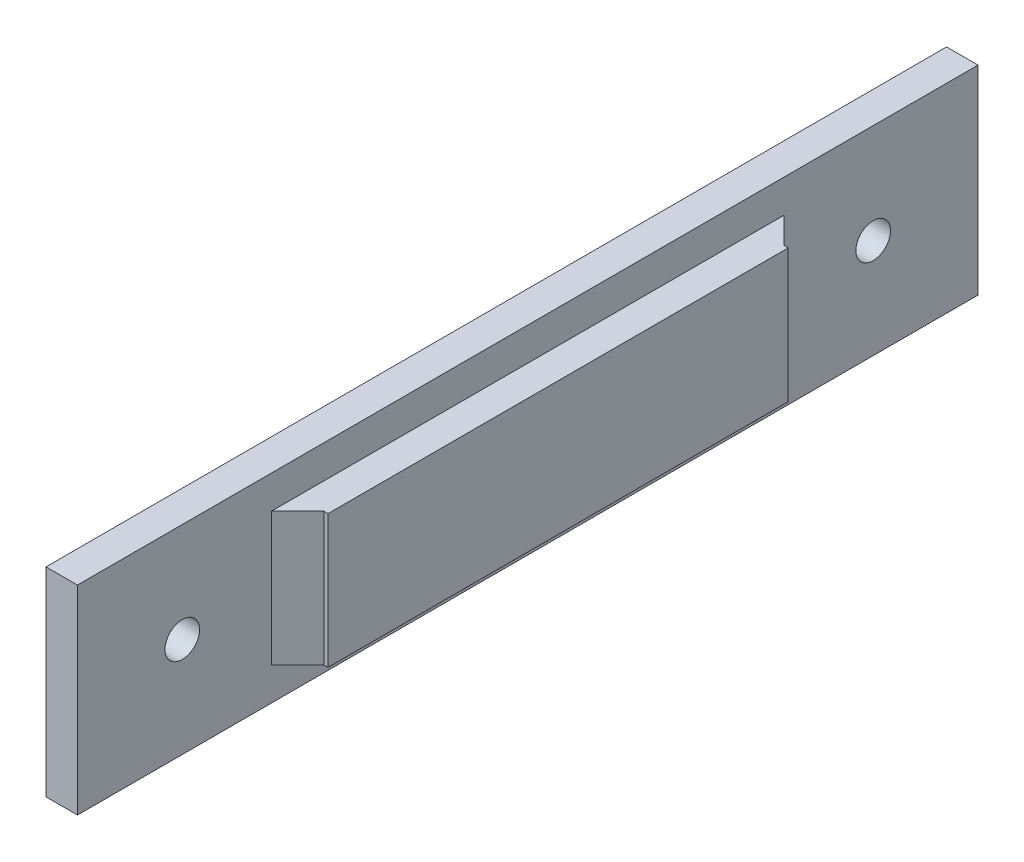
ISO-10303-21;
HEADER;
FILE_DESCRIPTION(('STEP AP214'),'2;1');
FILE_NAME('part.step','',(''),(''),'','','');
FILE_SCHEMA(('AUTOMOTIVE_DESIGN { 1 0 10303 214 1 1 1 1 }'));
ENDSEC;
DATA;
#1=APPLICATION_CONTEXT('core data for automotive mechanical design processes');
#2=APPLICATION_PROTOCOL_DEFINITION('international standard','automotive_design',2000,#1);
#3=PRODUCT_CONTEXT('',#1,'mechanical');
#4=PRODUCT('Part','Part','',(#3));
#5=PRODUCT_RELATED_PRODUCT_CATEGORY('part','',(#4));
#6=PRODUCT_DEFINITION_FORMATION('','',#4);
#7=PRODUCT_DEFINITION_CONTEXT('part definition',#1,'design');
#8=PRODUCT_DEFINITION('design','',#6,#7);
#9=PRODUCT_DEFINITION_SHAPE('','',#8);
#10=(LENGTH_UNIT() NAMED_UNIT(*) SI_UNIT(.MILLI.,.METRE.));
#11=(NAMED_UNIT(*) PLANE_ANGLE_UNIT() SI_UNIT($,.RADIAN.));
#12=(NAMED_UNIT(*) SI_UNIT($,.STERADIAN.) SOLID_ANGLE_UNIT());
#13=UNCERTAINTY_MEASURE_WITH_UNIT(LENGTH_MEASURE(1.E-05),#10,'distance_accuracy_value','');
#14=(GEOMETRIC_REPRESENTATION_CONTEXT(3) GLOBAL_UNCERTAINTY_ASSIGNED_CONTEXT((#13)) GLOBAL_UNIT_ASSIGNED_CONTEXT((#10,
#11,#12)) REPRESENTATION_CONTEXT('',''));
#15=CARTESIAN_POINT('',(0.,0.,0.));
#16=DIRECTION('',(0.,0.,1.));
#17=DIRECTION('',(1.,0.,0.));
#18=AXIS2_PLACEMENT_3D('',#15,#16,#17);
#19=CARTESIAN_POINT('',(0.,0.,85.9));
#20=DIRECTION('',(0.,0.,1.));
#21=DIRECTION('',(1.,0.,0.));
#22=AXIS2_PLACEMENT_3D('',#19,#20,#21);
#23=PLANE('',#22);
#24=DIRECTION('',(1.,0.,0.));
#25=VECTOR('',#24,1.);
#26=CARTESIAN_POINT('',(0.,-3.,85.9));
#27=LINE('',#26,#25);
#28=CARTESIAN_POINT('',(-3.,-3.,85.9));
#29=VERTEX_POINT('',#28);
#30=CARTESIAN_POINT('',(0.,-3.,85.9));
#31=VERTEX_POINT('',#30);
#32=EDGE_CURVE('E192',#29,#31,#27,.T.);
#33=ORIENTED_EDGE('',*,*,#32,.T.);
#34=DIRECTION('',(0.,-1.,0.));
#35=VECTOR('',#34,1.);
#36=CARTESIAN_POINT('',(0.,0.,85.9));
#37=LINE('',#36,#35);
#38=CARTESIAN_POINT('',(0.,16.,85.9));
#39=VERTEX_POINT('',#38);
#40=EDGE_CURVE('E185',#39,#31,#37,.T.);
#41=ORIENTED_EDGE('',*,*,#40,.F.);
#42=DIRECTION('',(-1.,0.,0.));
#43=VECTOR('',#42,1.);
#44=CARTESIAN_POINT('',(0.,16.,85.9));
#45=LINE('',#44,#43);
#46=CARTESIAN_POINT('',(-3.,16.,85.9));
#47=VERTEX_POINT('',#46);
#48=EDGE_CURVE('E196',#39,#47,#45,.T.);
#49=ORIENTED_EDGE('',*,*,#48,.T.);
#50=DIRECTION('',(0.,-1.,0.));
#51=VECTOR('',#50,1.);
#52=CARTESIAN_POINT('',(-3.,0.,85.9));
#53=LINE('',#52,#51);
#54=EDGE_CURVE('E189',#47,#29,#53,.T.);
#55=ORIENTED_EDGE('',*,*,#54,.T.);
#56=EDGE_LOOP('',(#33,#41,#49,#55));
#57=FACE_BOUND('',#56,.T.);
#58=ADVANCED_FACE('F62',(#57),#23,.T.);
#59=CARTESIAN_POINT('',(0.,0.,0.));
#60=DIRECTION('',(0.,0.,1.));
#61=DIRECTION('',(1.,0.,0.));
#62=AXIS2_PLACEMENT_3D('',#59,#60,#61);
#63=PLANE('',#62);
#64=DIRECTION('',(0.,-1.,0.));
#65=VECTOR('',#64,1.);
#66=CARTESIAN_POINT('',(0.,0.,0.));
#67=LINE('',#66,#65);
#68=CARTESIAN_POINT('',(0.,16.,0.));
#69=VERTEX_POINT('',#68);
#70=CARTESIAN_POINT('',(0.,-3.,0.));
#71=VERTEX_POINT('',#70);
#72=EDGE_CURVE('E184',#69,#71,#67,.T.);
#73=ORIENTED_EDGE('',*,*,#72,.T.);
#74=DIRECTION('',(1.,0.,0.));
#75=VECTOR('',#74,1.);
#76=CARTESIAN_POINT('',(0.,-3.,0.));
#77=LINE('',#76,#75);
#78=CARTESIAN_POINT('',(-3.,-3.,0.));
#79=VERTEX_POINT('',#78);
#80=EDGE_CURVE('E201',#79,#71,#77,.T.);
#81=ORIENTED_EDGE('',*,*,#80,.F.);
#82=DIRECTION('',(0.,-1.,0.));
#83=VECTOR('',#82,1.);
#84=CARTESIAN_POINT('',(-3.,0.,0.));
#85=LINE('',#84,#83);
#86=CARTESIAN_POINT('',(-3.,16.,0.));
#87=VERTEX_POINT('',#86);
#88=EDGE_CURVE('E187',#87,#79,#85,.T.);
#89=ORIENTED_EDGE('',*,*,#88,.F.);
#90=DIRECTION('',(-1.,0.,0.));
#91=VECTOR('',#90,1.);
#92=CARTESIAN_POINT('',(0.,16.,0.));
#93=LINE('',#92,#91);
#94=EDGE_CURVE('E193',#69,#87,#93,.T.);
#95=ORIENTED_EDGE('',*,*,#94,.F.);
#96=EDGE_LOOP('',(#73,#81,#89,#95));
#97=FACE_BOUND('',#96,.T.);
#98=ADVANCED_FACE('F253',(#97),#63,.F.);
#99=CARTESIAN_POINT('',(0.,-3.,85.9));
#100=DIRECTION('',(0.,1.,0.));
#101=DIRECTION('',(0.,0.,1.));
#102=AXIS2_PLACEMENT_3D('',#99,#100,#101);
#103=PLANE('',#102);
#104=DIRECTION('',(0.,0.,-1.));
#105=VECTOR('',#104,1.);
#106=CARTESIAN_POINT('',(0.,-3.,85.9));
#107=LINE('',#106,#105);
#108=EDGE_CURVE('E161',#31,#71,#107,.T.);
#109=ORIENTED_EDGE('',*,*,#108,.F.);
#110=ORIENTED_EDGE('',*,*,#32,.F.);
#111=DIRECTION('',(0.,0.,-1.));
#112=VECTOR('',#111,1.);
#113=CARTESIAN_POINT('',(-3.,-3.,85.9));
#114=LINE('',#113,#112);
#115=EDGE_CURVE('E207',#29,#79,#114,.T.);
#116=ORIENTED_EDGE('',*,*,#115,.T.);
#117=ORIENTED_EDGE('',*,*,#80,.T.);
#118=EDGE_LOOP('',(#109,#110,#116,#117));
#119=FACE_BOUND('',#118,.T.);
#120=ADVANCED_FACE('F259',(#119),#103,.F.);
#121=CARTESIAN_POINT('',(0.,16.,85.9));
#122=DIRECTION('',(0.,-1.,0.));
#123=DIRECTION('',(0.,0.,-1.));
#124=AXIS2_PLACEMENT_3D('',#121,#122,#123);
#125=PLANE('',#124);
#126=DIRECTION('',(0.,0.,1.));
#127=VECTOR('',#126,1.);
#128=CARTESIAN_POINT('',(0.,16.,85.9));
#129=LINE('',#128,#127);
#130=EDGE_CURVE('E164',#69,#39,#129,.T.);
#131=ORIENTED_EDGE('',*,*,#130,.F.);
#132=ORIENTED_EDGE('',*,*,#94,.T.);
#133=DIRECTION('',(0.,0.,-1.));
#134=VECTOR('',#133,1.);
#135=CARTESIAN_POINT('',(-3.,16.,85.9));
#136=LINE('',#135,#134);
#137=EDGE_CURVE('E198',#47,#87,#136,.T.);
#138=ORIENTED_EDGE('',*,*,#137,.F.);
#139=ORIENTED_EDGE('',*,*,#48,.F.);
#140=EDGE_LOOP('',(#131,#132,#138,#139));
#141=FACE_BOUND('',#140,.T.);
#142=ADVANCED_FACE('F265',(#141),#125,.F.);
#143=CARTESIAN_POINT('',(-3.,0.,85.9));
#144=DIRECTION('',(1.,0.,0.));
#145=DIRECTION('',(0.,0.,-1.));
#146=AXIS2_PLACEMENT_3D('',#143,#144,#145);
#147=PLANE('',#146);
#148=CARTESIAN_POINT('',(-3.,6.5,10.));
#149=DIRECTION('',(-1.,0.,0.));
#150=DIRECTION('',(0.,0.,1.));
#151=AXIS2_PLACEMENT_3D('',#148,#149,#150);
#152=CIRCLE('',#151,1.65);
#153=CARTESIAN_POINT('',(-3.,6.5,11.65));
#154=VERTEX_POINT('',#153);
#155=EDGE_CURVE('E173',#154,#154,#152,.T.);
#156=ORIENTED_EDGE('',*,*,#155,.F.);
#157=EDGE_LOOP('',(#156));
#158=FACE_BOUND('',#157,.T.);
#159=CARTESIAN_POINT('',(-3.,6.5,75.9));
#160=DIRECTION('',(-1.,0.,0.));
#161=DIRECTION('',(0.,0.,1.));
#162=AXIS2_PLACEMENT_3D('',#159,#160,#161);
#163=CIRCLE('',#162,1.65);
#164=CARTESIAN_POINT('',(-3.,6.5,77.55));
#165=VERTEX_POINT('',#164);
#166=EDGE_CURVE('E172',#165,#165,#163,.T.);
#167=ORIENTED_EDGE('',*,*,#166,.F.);
#168=EDGE_LOOP('',(#167));
#169=FACE_BOUND('',#168,.T.);
#170=ORIENTED_EDGE('',*,*,#88,.T.);
#171=ORIENTED_EDGE('',*,*,#115,.F.);
#172=ORIENTED_EDGE('',*,*,#54,.F.);
#173=ORIENTED_EDGE('',*,*,#137,.T.);
#174=EDGE_LOOP('',(#170,#171,#172,#173));
#175=FACE_BOUND('',#174,.T.);
#176=ADVANCED_FACE('F268',(#158,#169,#175),#147,.F.);
#177=CARTESIAN_POINT('',(0.,0.,85.9));
#178=DIRECTION('',(1.,0.,0.));
#179=DIRECTION('',(0.,0.,-1.));
#180=AXIS2_PLACEMENT_3D('',#177,#178,#179);
#181=PLANE('',#180);
#182=DIRECTION('',(0.,0.,1.));
#183=VECTOR('',#182,1.);
#184=CARTESIAN_POINT('',(0.,12.85,64.9));
#185=LINE('',#184,#183);
#186=CARTESIAN_POINT('',(0.,12.85,18.5));
#187=VERTEX_POINT('',#186);
#188=CARTESIAN_POINT('',(0.,12.85,67.4));
#189=VERTEX_POINT('',#188);
#190=EDGE_CURVE('E157',#187,#189,#185,.T.);
#191=ORIENTED_EDGE('',*,*,#190,.F.);
#192=DIRECTION('',(0.,-1.,0.));
#193=VECTOR('',#192,1.);
#194=CARTESIAN_POINT('',(0.,0.,18.5));
#195=LINE('',#194,#193);
#196=CARTESIAN_POINT('',(0.,0.150000000000021,18.5));
#197=VERTEX_POINT('',#196);
#198=EDGE_CURVE('E216',#187,#197,#195,.T.);
#199=ORIENTED_EDGE('',*,*,#198,.T.);
#200=DIRECTION('',(0.,0.,-1.));
#201=VECTOR('',#200,1.);
#202=CARTESIAN_POINT('',(0.,0.149999999999987,64.9));
#203=LINE('',#202,#201);
#204=CARTESIAN_POINT('',(0.,0.149999999999986,67.4));
#205=VERTEX_POINT('',#204);
#206=EDGE_CURVE('E224',#205,#197,#203,.T.);
#207=ORIENTED_EDGE('',*,*,#206,.F.);
#208=DIRECTION('',(0.,1.,0.));
#209=VECTOR('',#208,1.);
#210=CARTESIAN_POINT('',(0.,0.,67.4));
#211=LINE('',#210,#209);
#212=EDGE_CURVE('E213',#205,#189,#211,.T.);
#213=ORIENTED_EDGE('',*,*,#212,.T.);
#214=EDGE_LOOP('',(#191,#199,#207,#213));
#215=FACE_BOUND('',#214,.T.);
#216=CARTESIAN_POINT('',(0.,6.5,10.));
#217=DIRECTION('',(1.,0.,0.));
#218=DIRECTION('',(0.,0.,-1.));
#219=AXIS2_PLACEMENT_3D('',#216,#217,#218);
#220=CIRCLE('',#219,1.65);
#221=CARTESIAN_POINT('',(0.,6.5,11.65));
#222=VERTEX_POINT('',#221);
#223=EDGE_CURVE('E181',#222,#222,#220,.T.);
#224=ORIENTED_EDGE('',*,*,#223,.F.);
#225=EDGE_LOOP('',(#224));
#226=FACE_BOUND('',#225,.T.);
#227=CARTESIAN_POINT('',(0.,6.5,75.9));
#228=DIRECTION('',(1.,0.,0.));
#229=DIRECTION('',(0.,0.,-1.));
#230=AXIS2_PLACEMENT_3D('',#227,#228,#229);
#231=CIRCLE('',#230,1.65);
#232=CARTESIAN_POINT('',(0.,6.5,77.55));
#233=VERTEX_POINT('',#232);
#234=EDGE_CURVE('E176',#233,#233,#231,.T.);
#235=ORIENTED_EDGE('',*,*,#234,.F.);
#236=EDGE_LOOP('',(#235));
#237=FACE_BOUND('',#236,.T.);
#238=ORIENTED_EDGE('',*,*,#72,.F.);
#239=ORIENTED_EDGE('',*,*,#130,.T.);
#240=ORIENTED_EDGE('',*,*,#40,.T.);
#241=ORIENTED_EDGE('',*,*,#108,.T.);
#242=EDGE_LOOP('',(#238,#239,#240,#241));
#243=FACE_BOUND('',#242,.T.);
#244=ADVANCED_FACE('F226',(#215,#226,#237,#243),#181,.T.);
#245=CARTESIAN_POINT('',(27.,6.5,75.9));
#246=DIRECTION('',(-1.,0.,0.));
#247=DIRECTION('',(0.,0.,1.));
#248=AXIS2_PLACEMENT_3D('',#245,#246,#247);
#249=CYLINDRICAL_SURFACE('',#248,1.65);
#250=CARTESIAN_POINT('',(0.,6.5,77.55));
#251=CARTESIAN_POINT('',(-0.0312500000000035,6.5,77.55));
#252=CARTESIAN_POINT('',(-0.0625000000000035,6.5,77.55));
#253=CARTESIAN_POINT('',(-0.125000000000004,6.5,77.55));
#254=CARTESIAN_POINT('',(-0.156250000000004,6.5,77.55));
#255=CARTESIAN_POINT('',(-0.218750000000004,6.5,77.55));
#256=CARTESIAN_POINT('',(-0.250000000000004,6.5,77.55));
#257=CARTESIAN_POINT('',(-0.312500000000004,6.5,77.55));
#258=CARTESIAN_POINT('',(-0.343750000000004,6.5,77.55));
#259=CARTESIAN_POINT('',(-0.406250000000004,6.5,77.55));
#260=CARTESIAN_POINT('',(-0.437500000000004,6.5,77.55));
#261=CARTESIAN_POINT('',(-0.500000000000004,6.5,77.55));
#262=CARTESIAN_POINT('',(-0.531250000000004,6.5,77.55));
#263=CARTESIAN_POINT('',(-0.593750000000004,6.5,77.55));
#264=CARTESIAN_POINT('',(-0.625000000000004,6.5,77.55));
#265=CARTESIAN_POINT('',(-0.687500000000004,6.5,77.55));
#266=CARTESIAN_POINT('',(-0.718750000000004,6.5,77.55));
#267=CARTESIAN_POINT('',(-0.781250000000003,6.5,77.55));
#268=CARTESIAN_POINT('',(-0.812500000000002,6.5,77.55));
#269=CARTESIAN_POINT('',(-0.875000000000001,6.5,77.55));
#270=CARTESIAN_POINT('',(-0.906250000000001,6.5,77.55));
#271=CARTESIAN_POINT('',(-0.968750000000001,6.5,77.55));
#272=CARTESIAN_POINT('',(-1.,6.5,77.55));
#273=CARTESIAN_POINT('',(-1.0625,6.5,77.55));
#274=CARTESIAN_POINT('',(-1.09375,6.5,77.55));
#275=CARTESIAN_POINT('',(-1.15625,6.5,77.55));
#276=CARTESIAN_POINT('',(-1.1875,6.5,77.55));
#277=CARTESIAN_POINT('',(-1.25,6.5,77.55));
#278=CARTESIAN_POINT('',(-1.28125,6.5,77.55));
#279=CARTESIAN_POINT('',(-1.34375,6.5,77.55));
#280=CARTESIAN_POINT('',(-1.375,6.5,77.55));
#281=CARTESIAN_POINT('',(-1.4375,6.5,77.55));
#282=CARTESIAN_POINT('',(-1.46875,6.5,77.55));
#283=CARTESIAN_POINT('',(-1.53125,6.5,77.55));
#284=CARTESIAN_POINT('',(-1.5625,6.5,77.55));
#285=CARTESIAN_POINT('',(-1.625,6.5,77.55));
#286=CARTESIAN_POINT('',(-1.65625,6.5,77.55));
#287=CARTESIAN_POINT('',(-1.71875,6.5,77.55));
#288=CARTESIAN_POINT('',(-1.75,6.5,77.55));
#289=CARTESIAN_POINT('',(-1.8125,6.5,77.55));
#290=CARTESIAN_POINT('',(-1.84375,6.5,77.55));
#291=CARTESIAN_POINT('',(-1.90625,6.5,77.55));
#292=CARTESIAN_POINT('',(-1.9375,6.5,77.55));
#293=CARTESIAN_POINT('',(-2.,6.5,77.55));
#294=CARTESIAN_POINT('',(-2.03125,6.5,77.55));
#295=CARTESIAN_POINT('',(-2.09375,6.5,77.55));
#296=CARTESIAN_POINT('',(-2.125,6.5,77.55));
#297=CARTESIAN_POINT('',(-2.1875,6.5,77.55));
#298=CARTESIAN_POINT('',(-2.21875,6.5,77.55));
#299=CARTESIAN_POINT('',(-2.28125,6.5,77.55));
#300=CARTESIAN_POINT('',(-2.3125,6.5,77.55));
#301=CARTESIAN_POINT('',(-2.375,6.5,77.55));
#302=CARTESIAN_POINT('',(-2.40625,6.5,77.55));
#303=CARTESIAN_POINT('',(-2.46875,6.5,77.55));
#304=CARTESIAN_POINT('',(-2.5,6.5,77.55));
#305=CARTESIAN_POINT('',(-2.5625,6.5,77.55));
#306=CARTESIAN_POINT('',(-2.59375,6.5,77.55));
#307=CARTESIAN_POINT('',(-2.65625,6.5,77.55));
#308=CARTESIAN_POINT('',(-2.6875,6.5,77.55));
#309=CARTESIAN_POINT('',(-2.75,6.5,77.55));
#310=CARTESIAN_POINT('',(-2.78125,6.5,77.55));
#311=CARTESIAN_POINT('',(-2.84375,6.5,77.55));
#312=CARTESIAN_POINT('',(-2.875,6.5,77.55));
#313=CARTESIAN_POINT('',(-2.9375,6.5,77.55));
#314=CARTESIAN_POINT('',(-2.96875,6.5,77.55));
#315=CARTESIAN_POINT('',(-3.,6.5,77.55));
#316=B_SPLINE_CURVE_WITH_KNOTS('',3,(#250,#251,#252,#253,#254,#255,#256,#257,#258,#259,#260,
#261,#262,#263,#264,#265,#266,#267,#268,#269,#270,#271,#272,#273,#274,#275,#276,#277,#278,#279,
#280,#281,#282,#283,#284,#285,#286,#287,#288,#289,#290,#291,#292,#293,#294,#295,#296,#297,#298,
#299,#300,#301,#302,#303,#304,#305,#306,#307,#308,#309,#310,#311,#312,#313,#314,#315),
.UNSPECIFIED.,.F.,.F.,(4,2,2,2,2,2,2,2,2,2,2,2,2,2,2,2,2,2,2,2,2,2,2,2,2,2,2,2,2,2,2,2,4),(0.,
0.0937500000000001,0.1875,0.28125,0.375,0.46875,0.5625,0.656250000000001,0.750000000000001,
0.843749999999997,0.937499999999997,1.03125,1.125,1.21875,1.3125,1.40625,1.5,1.59375,1.6875,
1.78125,1.875,1.96875,2.0625,2.15625,2.25,2.34375,2.4375,2.53125,2.625,2.71875,2.8125,2.90625,
3.),.UNSPECIFIED.);
#317=EDGE_CURVE('BSEAM277',#233,#165,#316,.T.);
#318=ORIENTED_EDGE('',*,*,#234,.T.);
#319=ORIENTED_EDGE('',*,*,#166,.T.);
#320=ORIENTED_EDGE('',*,*,#317,.T.);
#321=ORIENTED_EDGE('',*,*,#317,.F.);
#322=EDGE_LOOP('',(#318,#320,#319,#321));
#323=FACE_BOUND('',#322,.T.);
#324=ADVANCED_FACE('F277',(#323),#249,.F.);
#325=CARTESIAN_POINT('',(27.,6.5,10.));
#326=DIRECTION('',(-1.,0.,0.));
#327=DIRECTION('',(0.,0.,1.));
#328=AXIS2_PLACEMENT_3D('',#325,#326,#327);
#329=CYLINDRICAL_SURFACE('',#328,1.65);
#330=CARTESIAN_POINT('',(0.,6.5,11.65));
#331=CARTESIAN_POINT('',(-0.0312500000000035,6.5,11.65));
#332=CARTESIAN_POINT('',(-0.0625000000000035,6.5,11.65));
#333=CARTESIAN_POINT('',(-0.125000000000004,6.5,11.65));
#334=CARTESIAN_POINT('',(-0.156250000000004,6.5,11.65));
#335=CARTESIAN_POINT('',(-0.218750000000004,6.5,11.65));
#336=CARTESIAN_POINT('',(-0.250000000000004,6.5,11.65));
#337=CARTESIAN_POINT('',(-0.312500000000004,6.5,11.65));
#338=CARTESIAN_POINT('',(-0.343750000000004,6.5,11.65));
#339=CARTESIAN_POINT('',(-0.406250000000004,6.5,11.65));
#340=CARTESIAN_POINT('',(-0.437500000000004,6.5,11.65));
#341=CARTESIAN_POINT('',(-0.500000000000004,6.5,11.65));
#342=CARTESIAN_POINT('',(-0.531250000000004,6.5,11.65));
#343=CARTESIAN_POINT('',(-0.593750000000004,6.5,11.65));
#344=CARTESIAN_POINT('',(-0.625000000000004,6.5,11.65));
#345=CARTESIAN_POINT('',(-0.687500000000004,6.5,11.65));
#346=CARTESIAN_POINT('',(-0.718750000000004,6.5,11.65));
#347=CARTESIAN_POINT('',(-0.781250000000003,6.5,11.65));
#348=CARTESIAN_POINT('',(-0.812500000000002,6.5,11.65));
#349=CARTESIAN_POINT('',(-0.875000000000001,6.5,11.65));
#350=CARTESIAN_POINT('',(-0.906250000000001,6.5,11.65));
#351=CARTESIAN_POINT('',(-0.968750000000001,6.5,11.65));
#352=CARTESIAN_POINT('',(-1.,6.5,11.65));
#353=CARTESIAN_POINT('',(-1.0625,6.5,11.65));
#354=CARTESIAN_POINT('',(-1.09375,6.5,11.65));
#355=CARTESIAN_POINT('',(-1.15625,6.5,11.65));
#356=CARTESIAN_POINT('',(-1.1875,6.5,11.65));
#357=CARTESIAN_POINT('',(-1.25,6.5,11.65));
#358=CARTESIAN_POINT('',(-1.28125,6.5,11.65));
#359=CARTESIAN_POINT('',(-1.34375,6.5,11.65));
#360=CARTESIAN_POINT('',(-1.375,6.5,11.65));
#361=CARTESIAN_POINT('',(-1.4375,6.5,11.65));
#362=CARTESIAN_POINT('',(-1.46875,6.5,11.65));
#363=CARTESIAN_POINT('',(-1.53125,6.5,11.65));
#364=CARTESIAN_POINT('',(-1.5625,6.5,11.65));
#365=CARTESIAN_POINT('',(-1.625,6.5,11.65));
#366=CARTESIAN_POINT('',(-1.65625,6.5,11.65));
#367=CARTESIAN_POINT('',(-1.71875,6.5,11.65));
#368=CARTESIAN_POINT('',(-1.75,6.5,11.65));
#369=CARTESIAN_POINT('',(-1.8125,6.5,11.65));
#370=CARTESIAN_POINT('',(-1.84375,6.5,11.65));
#371=CARTESIAN_POINT('',(-1.90625,6.5,11.65));
#372=CARTESIAN_POINT('',(-1.9375,6.5,11.65));
#373=CARTESIAN_POINT('',(-2.,6.5,11.65));
#374=CARTESIAN_POINT('',(-2.03125,6.5,11.65));
#375=CARTESIAN_POINT('',(-2.09375,6.5,11.65));
#376=CARTESIAN_POINT('',(-2.125,6.5,11.65));
#377=CARTESIAN_POINT('',(-2.1875,6.5,11.65));
#378=CARTESIAN_POINT('',(-2.21875,6.5,11.65));
#379=CARTESIAN_POINT('',(-2.28125,6.5,11.65));
#380=CARTESIAN_POINT('',(-2.3125,6.5,11.65));
#381=CARTESIAN_POINT('',(-2.375,6.5,11.65));
#382=CARTESIAN_POINT('',(-2.40625,6.5,11.65));
#383=CARTESIAN_POINT('',(-2.46875,6.5,11.65));
#384=CARTESIAN_POINT('',(-2.5,6.5,11.65));
#385=CARTESIAN_POINT('',(-2.5625,6.5,11.65));
#386=CARTESIAN_POINT('',(-2.59375,6.5,11.65));
#387=CARTESIAN_POINT('',(-2.65625,6.5,11.65));
#388=CARTESIAN_POINT('',(-2.6875,6.5,11.65));
#389=CARTESIAN_POINT('',(-2.75,6.5,11.65));
#390=CARTESIAN_POINT('',(-2.78125,6.5,11.65));
#391=CARTESIAN_POINT('',(-2.84375,6.5,11.65));
#392=CARTESIAN_POINT('',(-2.875,6.5,11.65));
#393=CARTESIAN_POINT('',(-2.9375,6.5,11.65));
#394=CARTESIAN_POINT('',(-2.96875,6.5,11.65));
#395=CARTESIAN_POINT('',(-3.,6.5,11.65));
#396=B_SPLINE_CURVE_WITH_KNOTS('',3,(#330,#331,#332,#333,#334,#335,#336,#337,#338,#339,#340,
#341,#342,#343,#344,#345,#346,#347,#348,#349,#350,#351,#352,#353,#354,#355,#356,#357,#358,#359,
#360,#361,#362,#363,#364,#365,#366,#367,#368,#369,#370,#371,#372,#373,#374,#375,#376,#377,#378,
#379,#380,#381,#382,#383,#384,#385,#386,#387,#388,#389,#390,#391,#392,#393,#394,#395),
.UNSPECIFIED.,.F.,.F.,(4,2,2,2,2,2,2,2,2,2,2,2,2,2,2,2,2,2,2,2,2,2,2,2,2,2,2,2,2,2,2,2,4),(0.,
0.0937500000000001,0.1875,0.28125,0.375,0.46875,0.5625,0.656250000000001,0.750000000000001,
0.843749999999997,0.937499999999997,1.03125,1.125,1.21875,1.3125,1.40625,1.5,1.59375,1.6875,
1.78125,1.875,1.96875,2.0625,2.15625,2.25,2.34375,2.4375,2.53125,2.625,2.71875,2.8125,2.90625,
3.),.UNSPECIFIED.);
#397=EDGE_CURVE('BSEAM293',#222,#154,#396,.T.);
#398=ORIENTED_EDGE('',*,*,#223,.T.);
#399=ORIENTED_EDGE('',*,*,#155,.T.);
#400=ORIENTED_EDGE('',*,*,#397,.T.);
#401=ORIENTED_EDGE('',*,*,#397,.F.);
#402=EDGE_LOOP('',(#398,#400,#399,#401));
#403=FACE_BOUND('',#402,.T.);
#404=ADVANCED_FACE('F293',(#403),#329,.F.);
#405=CARTESIAN_POINT('',(2.9,12.85,64.9));
#406=DIRECTION('',(0.,0.,-1.));
#407=DIRECTION('',(-1.,0.,0.));
#408=AXIS2_PLACEMENT_3D('',#405,#406,#407);
#409=PLANE('',#408);
#410=DIRECTION('',(-1.,0.,0.));
#411=VECTOR('',#410,1.);
#412=CARTESIAN_POINT('',(2.9,12.85,64.9));
#413=LINE('',#412,#411);
#414=CARTESIAN_POINT('',(2.9,12.85,64.9));
#415=VERTEX_POINT('',#414);
#416=CARTESIAN_POINT('',(2.50000000000002,12.85,64.9));
#417=VERTEX_POINT('',#416);
#418=EDGE_CURVE('E235',#415,#417,#413,.T.);
#419=ORIENTED_EDGE('',*,*,#418,.T.);
#420=DIRECTION('',(0.,-1.,0.));
#421=VECTOR('',#420,1.);
#422=CARTESIAN_POINT('',(2.50000000000002,12.85,64.9));
#423=LINE('',#422,#421);
#424=CARTESIAN_POINT('',(2.50000000000002,0.149999999999987,64.9));
#425=VERTEX_POINT('',#424);
#426=EDGE_CURVE('E160',#417,#425,#423,.T.);
#427=ORIENTED_EDGE('',*,*,#426,.T.);
#428=DIRECTION('',(-1.,0.,0.));
#429=VECTOR('',#428,1.);
#430=CARTESIAN_POINT('',(2.9,0.149999999999987,64.9));
#431=LINE('',#430,#429);
#432=CARTESIAN_POINT('',(2.9,0.149999999999987,64.9));
#433=VERTEX_POINT('',#432);
#434=EDGE_CURVE('E144',#433,#425,#431,.T.);
#435=ORIENTED_EDGE('',*,*,#434,.F.);
#436=DIRECTION('',(0.,-1.,0.));
#437=VECTOR('',#436,1.);
#438=CARTESIAN_POINT('',(2.9,12.85,64.9));
#439=LINE('',#438,#437);
#440=EDGE_CURVE('E150',#415,#433,#439,.T.);
#441=ORIENTED_EDGE('',*,*,#440,.F.);
#442=EDGE_LOOP('',(#419,#427,#435,#441));
#443=FACE_BOUND('',#442,.T.);
#444=ADVANCED_FACE('F159',(#443),#409,.F.);
#445=CARTESIAN_POINT('',(2.9,0.149999999999987,64.9));
#446=DIRECTION('',(0.,1.,0.));
#447=DIRECTION('',(0.,0.,1.));
#448=AXIS2_PLACEMENT_3D('',#445,#446,#447);
#449=PLANE('',#448);
#450=ORIENTED_EDGE('',*,*,#206,.T.);
#451=DIRECTION('',(0.70710678118655,0.,0.707106781186545));
#452=VECTOR('',#451,1.);
#453=CARTESIAN_POINT('',(24.65,0.150000000000003,43.1499999999998));
#454=LINE('',#453,#452);
#455=CARTESIAN_POINT('',(2.50000000000001,0.150000000000019,21.));
#456=VERTEX_POINT('',#455);
#457=EDGE_CURVE('E223',#197,#456,#454,.T.);
#458=ORIENTED_EDGE('',*,*,#457,.T.);
#459=DIRECTION('',(-1.,0.,0.));
#460=VECTOR('',#459,1.);
#461=CARTESIAN_POINT('',(2.9,0.150000000000019,21.));
#462=LINE('',#461,#460);
#463=CARTESIAN_POINT('',(2.9,0.150000000000019,21.));
#464=VERTEX_POINT('',#463);
#465=EDGE_CURVE('E146',#464,#456,#462,.T.);
#466=ORIENTED_EDGE('',*,*,#465,.F.);
#467=DIRECTION('',(0.,0.,-1.));
#468=VECTOR('',#467,1.);
#469=CARTESIAN_POINT('',(2.9,0.149999999999987,64.9));
#470=LINE('',#469,#468);
#471=EDGE_CURVE('E140',#433,#464,#470,.T.);
#472=ORIENTED_EDGE('',*,*,#471,.F.);
#473=ORIENTED_EDGE('',*,*,#434,.T.);
#474=DIRECTION('',(-0.70710678118655,0.,0.707106781186545));
#475=VECTOR('',#474,1.);
#476=CARTESIAN_POINT('',(2.70000000000001,0.149999999999987,64.7));
#477=LINE('',#476,#475);
#478=EDGE_CURVE('E71',#425,#205,#477,.T.);
#479=ORIENTED_EDGE('',*,*,#478,.T.);
#480=EDGE_LOOP('',(#450,#458,#466,#472,#473,#479));
#481=FACE_BOUND('',#480,.T.);
#482=ADVANCED_FACE('F142',(#481),#449,.F.);
#483=CARTESIAN_POINT('',(2.9,12.85,21.));
#484=DIRECTION('',(0.,0.,1.));
#485=DIRECTION('',(0.,-1.,0.));
#486=AXIS2_PLACEMENT_3D('',#483,#484,#485);
#487=PLANE('',#486);
#488=ORIENTED_EDGE('',*,*,#465,.T.);
#489=DIRECTION('',(0.,1.,0.));
#490=VECTOR('',#489,1.);
#491=CARTESIAN_POINT('',(2.50000000000001,12.85,21.));
#492=LINE('',#491,#490);
#493=CARTESIAN_POINT('',(2.50000000000001,12.85,21.));
#494=VERTEX_POINT('',#493);
#495=EDGE_CURVE('E210',#456,#494,#492,.T.);
#496=ORIENTED_EDGE('',*,*,#495,.T.);
#497=DIRECTION('',(-1.,0.,0.));
#498=VECTOR('',#497,1.);
#499=CARTESIAN_POINT('',(2.9,12.85,21.));
#500=LINE('',#499,#498);
#501=CARTESIAN_POINT('',(2.9,12.85,21.));
#502=VERTEX_POINT('',#501);
#503=EDGE_CURVE('E166',#502,#494,#500,.T.);
#504=ORIENTED_EDGE('',*,*,#503,.F.);
#505=DIRECTION('',(0.,1.,0.));
#506=VECTOR('',#505,1.);
#507=CARTESIAN_POINT('',(2.9,12.85,21.));
#508=LINE('',#507,#506);
#509=EDGE_CURVE('E149',#464,#502,#508,.T.);
#510=ORIENTED_EDGE('',*,*,#509,.F.);
#511=EDGE_LOOP('',(#488,#496,#504,#510));
#512=FACE_BOUND('',#511,.T.);
#513=ADVANCED_FACE('F240',(#512),#487,.F.);
#514=CARTESIAN_POINT('',(2.9,12.85,64.9));
#515=DIRECTION('',(0.,-1.,0.));
#516=DIRECTION('',(0.,0.,-1.));
#517=AXIS2_PLACEMENT_3D('',#514,#515,#516);
#518=PLANE('',#517);
#519=ORIENTED_EDGE('',*,*,#190,.T.);
#520=DIRECTION('',(0.70710678118655,0.,-0.707106781186545));
#521=VECTOR('',#520,1.);
#522=CARTESIAN_POINT('',(2.70000000000001,12.85,64.7));
#523=LINE('',#522,#521);
#524=EDGE_CURVE('E12',#189,#417,#523,.T.);
#525=ORIENTED_EDGE('',*,*,#524,.T.);
#526=ORIENTED_EDGE('',*,*,#418,.F.);
#527=DIRECTION('',(0.,0.,1.));
#528=VECTOR('',#527,1.);
#529=CARTESIAN_POINT('',(2.9,12.85,64.9));
#530=LINE('',#529,#528);
#531=EDGE_CURVE('E155',#502,#415,#530,.T.);
#532=ORIENTED_EDGE('',*,*,#531,.F.);
#533=ORIENTED_EDGE('',*,*,#503,.T.);
#534=DIRECTION('',(-0.70710678118655,0.,-0.707106781186545));
#535=VECTOR('',#534,1.);
#536=CARTESIAN_POINT('',(24.65,12.85,43.1499999999998));
#537=LINE('',#536,#535);
#538=EDGE_CURVE('E220',#494,#187,#537,.T.);
#539=ORIENTED_EDGE('',*,*,#538,.T.);
#540=EDGE_LOOP('',(#519,#525,#526,#532,#533,#539));
#541=FACE_BOUND('',#540,.T.);
#542=ADVANCED_FACE('F238',(#541),#518,.F.);
#543=CARTESIAN_POINT('',(2.9,0.,0.));
#544=DIRECTION('',(1.,0.,0.));
#545=DIRECTION('',(0.,0.,-1.));
#546=AXIS2_PLACEMENT_3D('',#543,#544,#545);
#547=PLANE('',#546);
#548=ORIENTED_EDGE('',*,*,#440,.T.);
#549=ORIENTED_EDGE('',*,*,#471,.T.);
#550=ORIENTED_EDGE('',*,*,#509,.T.);
#551=ORIENTED_EDGE('',*,*,#531,.T.);
#552=EDGE_LOOP('',(#548,#549,#550,#551));
#553=FACE_BOUND('',#552,.T.);
#554=ADVANCED_FACE('F153',(#553),#547,.T.);
#555=CARTESIAN_POINT('',(2.50000000000001,12.85,21.));
#556=DIRECTION('',(-0.707106781186545,0.,0.70710678118655));
#557=DIRECTION('',(0.,1.,0.));
#558=AXIS2_PLACEMENT_3D('',#555,#556,#557);
#559=PLANE('',#558);
#560=ORIENTED_EDGE('',*,*,#457,.F.);
#561=ORIENTED_EDGE('',*,*,#198,.F.);
#562=ORIENTED_EDGE('',*,*,#538,.F.);
#563=ORIENTED_EDGE('',*,*,#495,.F.);
#564=EDGE_LOOP('',(#560,#561,#562,#563));
#565=FACE_BOUND('',#564,.T.);
#566=ADVANCED_FACE('F243',(#565),#559,.F.);
#567=CARTESIAN_POINT('',(2.50000000000002,12.85,64.9));
#568=DIRECTION('',(-0.707106781186544,0.,-0.70710678118655));
#569=DIRECTION('',(0.,-1.,0.));
#570=AXIS2_PLACEMENT_3D('',#567,#568,#569);
#571=PLANE('',#570);
#572=ORIENTED_EDGE('',*,*,#524,.F.);
#573=ORIENTED_EDGE('',*,*,#212,.F.);
#574=ORIENTED_EDGE('',*,*,#478,.F.);
#575=ORIENTED_EDGE('',*,*,#426,.F.);
#576=EDGE_LOOP('',(#572,#573,#574,#575));
#577=FACE_BOUND('',#576,.T.);
#578=ADVANCED_FACE('F65',(#577),#571,.F.);
#579=CLOSED_SHELL('',(#58,#98,#120,#142,#176,#244,#324,#404,#444,#482,#513,#542,#554,#566,#578));
#580=MANIFOLD_SOLID_BREP('B2',#579);
#581=ADVANCED_BREP_SHAPE_REPRESENTATION('',(#18,#580),#14);
#582=SHAPE_DEFINITION_REPRESENTATION(#9,#581);
ENDSEC;
END-ISO-10303-21;
